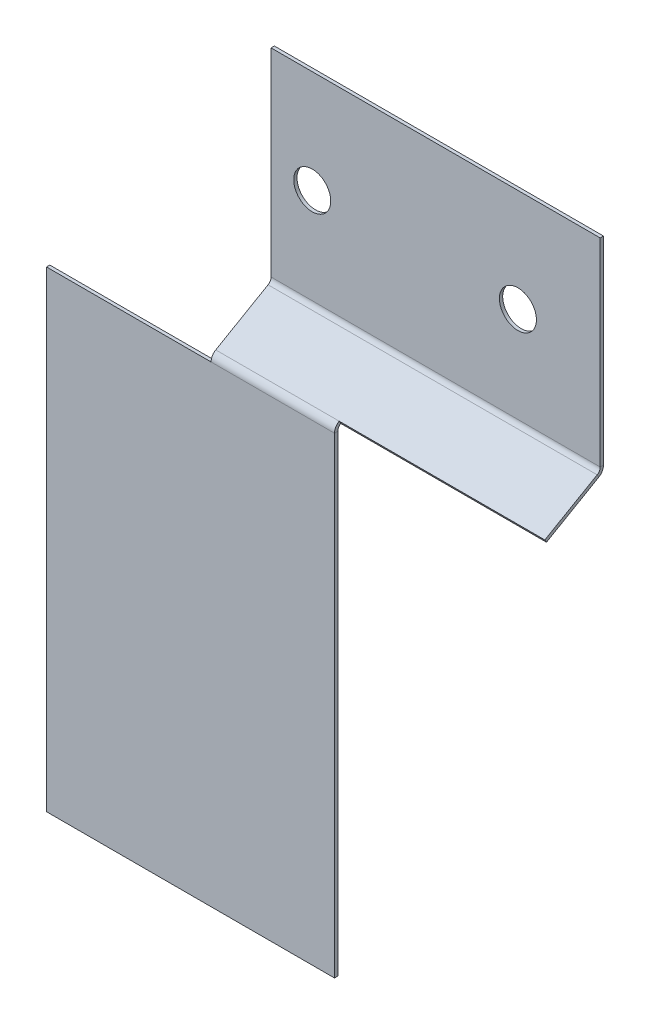
ISO-10303-21;
HEADER;
FILE_DESCRIPTION(('STEP AP214'),'2;1');
FILE_NAME('part.step','',(''),(''),'','','');
FILE_SCHEMA(('AUTOMOTIVE_DESIGN { 1 0 10303 214 1 1 1 1 }'));
ENDSEC;
DATA;
#1=APPLICATION_CONTEXT('core data for automotive mechanical design processes');
#2=APPLICATION_PROTOCOL_DEFINITION('international standard','automotive_design',2000,#1);
#3=PRODUCT_CONTEXT('',#1,'mechanical');
#4=PRODUCT('Part','Part','',(#3));
#5=PRODUCT_RELATED_PRODUCT_CATEGORY('part','',(#4));
#6=PRODUCT_DEFINITION_FORMATION('','',#4);
#7=PRODUCT_DEFINITION_CONTEXT('part definition',#1,'design');
#8=PRODUCT_DEFINITION('design','',#6,#7);
#9=PRODUCT_DEFINITION_SHAPE('','',#8);
#10=(LENGTH_UNIT() NAMED_UNIT(*) SI_UNIT(.MILLI.,.METRE.));
#11=(NAMED_UNIT(*) PLANE_ANGLE_UNIT() SI_UNIT($,.RADIAN.));
#12=(NAMED_UNIT(*) SI_UNIT($,.STERADIAN.) SOLID_ANGLE_UNIT());
#13=UNCERTAINTY_MEASURE_WITH_UNIT(LENGTH_MEASURE(1.E-05),#10,'distance_accuracy_value','');
#14=(GEOMETRIC_REPRESENTATION_CONTEXT(3) GLOBAL_UNCERTAINTY_ASSIGNED_CONTEXT((#13)) GLOBAL_UNIT_ASSIGNED_CONTEXT((#10,
#11,#12)) REPRESENTATION_CONTEXT('',''));
#15=CARTESIAN_POINT('',(0.,0.,0.));
#16=DIRECTION('',(0.,0.,1.));
#17=DIRECTION('',(1.,0.,0.));
#18=AXIS2_PLACEMENT_3D('',#15,#16,#17);
#19=CARTESIAN_POINT('',(0.,-3.76905989232418,6.52820323027549));
#20=DIRECTION('',(0.,0.500000000000004,-0.866025403784436));
#21=DIRECTION('',(0.,0.866025403784436,0.500000000000004));
#22=AXIS2_PLACEMENT_3D('',#19,#20,#21);
#23=PLANE('',#22);
#24=DIRECTION('',(0.,0.866025403784436,0.500000000000004));
#25=VECTOR('',#24,1.);
#26=CARTESIAN_POINT('',(15.,-3.76905989232418,6.52820323027549));
#27=LINE('',#26,#25);
#28=CARTESIAN_POINT('',(15.,-3.76905989232418,6.52820323027549));
#29=VERTEX_POINT('',#28);
#30=CARTESIAN_POINT('',(15.,-3.4226497308104,6.72820323027549));
#31=VERTEX_POINT('',#30);
#32=EDGE_CURVE('E92',#29,#31,#27,.T.);
#33=ORIENTED_EDGE('',*,*,#32,.F.);
#34=DIRECTION('',(-1.,0.,0.));
#35=VECTOR('',#34,1.);
#36=CARTESIAN_POINT('',(0.,-3.76905989232418,6.52820323027549));
#37=LINE('',#36,#35);
#38=CARTESIAN_POINT('',(40.,-3.76905989232418,6.52820323027549));
#39=VERTEX_POINT('',#38);
#40=EDGE_CURVE('E237',#39,#29,#37,.T.);
#41=ORIENTED_EDGE('',*,*,#40,.F.);
#42=DIRECTION('',(0.,0.866025403784436,0.500000000000004));
#43=VECTOR('',#42,1.);
#44=CARTESIAN_POINT('',(40.,-3.76905989232418,6.52820323027549));
#45=LINE('',#44,#43);
#46=CARTESIAN_POINT('',(40.,-3.4226497308104,6.72820323027549));
#47=VERTEX_POINT('',#46);
#48=EDGE_CURVE('E231',#39,#47,#45,.T.);
#49=ORIENTED_EDGE('',*,*,#48,.T.);
#50=DIRECTION('',(1.,0.,0.));
#51=VECTOR('',#50,1.);
#52=CARTESIAN_POINT('',(0.,-3.4226497308104,6.72820323027549));
#53=LINE('',#52,#51);
#54=EDGE_CURVE('E244',#47,#31,#53,.F.);
#55=ORIENTED_EDGE('',*,*,#54,.T.);
#56=EDGE_LOOP('',(#33,#41,#49,#55));
#57=FACE_BOUND('',#56,.T.);
#58=ADVANCED_FACE('F77',(#57),#23,.F.);
#59=CARTESIAN_POINT('',(40.,0.,-0.4));
#60=DIRECTION('',(1.,0.,0.));
#61=DIRECTION('',(0.,0.,-1.));
#62=AXIS2_PLACEMENT_3D('',#59,#60,#61);
#63=PLANE('',#62);
#64=DIRECTION('',(0.,1.,0.));
#65=VECTOR('',#64,1.);
#66=CARTESIAN_POINT('',(40.,0.,0.));
#67=LINE('',#66,#65);
#68=CARTESIAN_POINT('',(40.,0.887156423636778,0.));
#69=VERTEX_POINT('',#68);
#70=CARTESIAN_POINT('',(40.,25.,0.));
#71=VERTEX_POINT('',#70);
#72=EDGE_CURVE('E303',#69,#71,#67,.T.);
#73=ORIENTED_EDGE('',*,*,#72,.F.);
#74=DIRECTION('',(0.,0.,-1.));
#75=VECTOR('',#74,1.);
#76=CARTESIAN_POINT('',(40.,0.887156423636778,0.));
#77=LINE('',#76,#75);
#78=CARTESIAN_POINT('',(40.,0.887156423636778,-0.4));
#79=VERTEX_POINT('',#78);
#80=EDGE_CURVE('E265',#69,#79,#77,.T.);
#81=ORIENTED_EDGE('',*,*,#80,.T.);
#82=DIRECTION('',(0.,1.,0.));
#83=VECTOR('',#82,1.);
#84=CARTESIAN_POINT('',(40.,0.,-0.4));
#85=LINE('',#84,#83);
#86=CARTESIAN_POINT('',(40.,25.,-0.4));
#87=VERTEX_POINT('',#86);
#88=EDGE_CURVE('E295',#79,#87,#85,.T.);
#89=ORIENTED_EDGE('',*,*,#88,.T.);
#90=DIRECTION('',(0.,0.,1.));
#91=VECTOR('',#90,1.);
#92=CARTESIAN_POINT('',(40.,25.,-0.4));
#93=LINE('',#92,#91);
#94=EDGE_CURVE('E81',#87,#71,#93,.T.);
#95=ORIENTED_EDGE('',*,*,#94,.T.);
#96=EDGE_LOOP('',(#73,#81,#89,#95));
#97=FACE_BOUND('',#96,.T.);
#98=ADVANCED_FACE('F333',(#97),#63,.T.);
#99=CARTESIAN_POINT('',(0.,0.,-0.4));
#100=DIRECTION('',(0.,0.,-1.));
#101=DIRECTION('',(-1.,0.,0.));
#102=AXIS2_PLACEMENT_3D('',#99,#100,#101);
#103=PLANE('',#102);
#104=CARTESIAN_POINT('',(30.,12.5,-0.4));
#105=DIRECTION('',(0.,0.,1.));
#106=DIRECTION('',(1.,0.,0.));
#107=AXIS2_PLACEMENT_3D('',#104,#105,#106);
#108=CIRCLE('',#107,2.25);
#109=CARTESIAN_POINT('',(32.25,12.5,-0.4));
#110=VERTEX_POINT('',#109);
#111=EDGE_CURVE('E280',#110,#110,#108,.T.);
#112=ORIENTED_EDGE('',*,*,#111,.T.);
#113=EDGE_LOOP('',(#112));
#114=FACE_BOUND('',#113,.T.);
#115=CARTESIAN_POINT('',(5.,12.5,-0.4));
#116=DIRECTION('',(0.,0.,1.));
#117=DIRECTION('',(1.,0.,0.));
#118=AXIS2_PLACEMENT_3D('',#115,#116,#117);
#119=CIRCLE('',#118,2.25);
#120=CARTESIAN_POINT('',(7.25,12.5,-0.4));
#121=VERTEX_POINT('',#120);
#122=EDGE_CURVE('E286',#121,#121,#119,.T.);
#123=ORIENTED_EDGE('',*,*,#122,.T.);
#124=EDGE_LOOP('',(#123));
#125=FACE_BOUND('',#124,.T.);
#126=ORIENTED_EDGE('',*,*,#88,.F.);
#127=DIRECTION('',(1.,0.,0.));
#128=VECTOR('',#127,1.);
#129=CARTESIAN_POINT('',(40.,0.887156423636778,-0.4));
#130=LINE('',#129,#128);
#131=CARTESIAN_POINT('',(0.,0.887156423636781,-0.4));
#132=VERTEX_POINT('',#131);
#133=EDGE_CURVE('E260',#79,#132,#130,.F.);
#134=ORIENTED_EDGE('',*,*,#133,.T.);
#135=DIRECTION('',(0.,-1.,0.));
#136=VECTOR('',#135,1.);
#137=CARTESIAN_POINT('',(0.,0.,-0.4));
#138=LINE('',#137,#136);
#139=CARTESIAN_POINT('',(0.,25.,-0.4));
#140=VERTEX_POINT('',#139);
#141=EDGE_CURVE('E292',#140,#132,#138,.T.);
#142=ORIENTED_EDGE('',*,*,#141,.F.);
#143=DIRECTION('',(-1.,0.,0.));
#144=VECTOR('',#143,1.);
#145=CARTESIAN_POINT('',(0.,25.,-0.4));
#146=LINE('',#145,#144);
#147=EDGE_CURVE('E298',#87,#140,#146,.T.);
#148=ORIENTED_EDGE('',*,*,#147,.F.);
#149=EDGE_LOOP('',(#126,#134,#142,#148));
#150=FACE_BOUND('',#149,.T.);
#151=ADVANCED_FACE('F325',(#114,#125,#150),#103,.T.);
#152=CARTESIAN_POINT('',(0.,0.,0.));
#153=DIRECTION('',(0.,0.,-1.));
#154=DIRECTION('',(-1.,0.,0.));
#155=AXIS2_PLACEMENT_3D('',#152,#153,#154);
#156=PLANE('',#155);
#157=CARTESIAN_POINT('',(5.,12.5,0.));
#158=DIRECTION('',(0.,0.,1.));
#159=DIRECTION('',(1.,0.,0.));
#160=AXIS2_PLACEMENT_3D('',#157,#158,#159);
#161=CIRCLE('',#160,2.25);
#162=CARTESIAN_POINT('',(7.25,12.5,0.));
#163=VERTEX_POINT('',#162);
#164=EDGE_CURVE('E283',#163,#163,#161,.T.);
#165=ORIENTED_EDGE('',*,*,#164,.F.);
#166=EDGE_LOOP('',(#165));
#167=FACE_BOUND('',#166,.T.);
#168=CARTESIAN_POINT('',(30.,12.5,0.));
#169=DIRECTION('',(0.,0.,1.));
#170=DIRECTION('',(1.,0.,0.));
#171=AXIS2_PLACEMENT_3D('',#168,#169,#170);
#172=CIRCLE('',#171,2.25);
#173=CARTESIAN_POINT('',(32.25,12.5,0.));
#174=VERTEX_POINT('',#173);
#175=EDGE_CURVE('E277',#174,#174,#172,.T.);
#176=ORIENTED_EDGE('',*,*,#175,.F.);
#177=EDGE_LOOP('',(#176));
#178=FACE_BOUND('',#177,.T.);
#179=DIRECTION('',(1.,0.,0.));
#180=VECTOR('',#179,1.);
#181=CARTESIAN_POINT('',(40.,0.887156423636778,0.));
#182=LINE('',#181,#180);
#183=CARTESIAN_POINT('',(0.,0.887156423636778,0.));
#184=VERTEX_POINT('',#183);
#185=EDGE_CURVE('E271',#69,#184,#182,.F.);
#186=ORIENTED_EDGE('',*,*,#185,.F.);
#187=ORIENTED_EDGE('',*,*,#72,.T.);
#188=DIRECTION('',(-1.,0.,0.));
#189=VECTOR('',#188,1.);
#190=CARTESIAN_POINT('',(0.,25.,0.));
#191=LINE('',#190,#189);
#192=CARTESIAN_POINT('',(0.,25.,0.));
#193=VERTEX_POINT('',#192);
#194=EDGE_CURVE('E296',#71,#193,#191,.T.);
#195=ORIENTED_EDGE('',*,*,#194,.T.);
#196=DIRECTION('',(0.,-1.,0.));
#197=VECTOR('',#196,1.);
#198=CARTESIAN_POINT('',(0.,0.,0.));
#199=LINE('',#198,#197);
#200=EDGE_CURVE('E289',#193,#184,#199,.T.);
#201=ORIENTED_EDGE('',*,*,#200,.T.);
#202=EDGE_LOOP('',(#186,#187,#195,#201));
#203=FACE_BOUND('',#202,.T.);
#204=ADVANCED_FACE('F309',(#167,#178,#203),#156,.F.);
#205=CARTESIAN_POINT('',(0.,0.,-0.4));
#206=DIRECTION('',(-1.,0.,0.));
#207=DIRECTION('',(0.,0.,1.));
#208=AXIS2_PLACEMENT_3D('',#205,#206,#207);
#209=PLANE('',#208);
#210=DIRECTION('',(0.,0.,-1.));
#211=VECTOR('',#210,1.);
#212=CARTESIAN_POINT('',(0.,0.887156423636778,0.));
#213=LINE('',#212,#211);
#214=EDGE_CURVE('E275',#184,#132,#213,.T.);
#215=ORIENTED_EDGE('',*,*,#214,.F.);
#216=ORIENTED_EDGE('',*,*,#200,.F.);
#217=DIRECTION('',(0.,0.,1.));
#218=VECTOR('',#217,1.);
#219=CARTESIAN_POINT('',(0.,25.,-0.4));
#220=LINE('',#219,#218);
#221=EDGE_CURVE('E13',#140,#193,#220,.T.);
#222=ORIENTED_EDGE('',*,*,#221,.F.);
#223=ORIENTED_EDGE('',*,*,#141,.T.);
#224=EDGE_LOOP('',(#215,#216,#222,#223));
#225=FACE_BOUND('',#224,.T.);
#226=ADVANCED_FACE('F79',(#225),#209,.T.);
#227=CARTESIAN_POINT('',(0.,25.,-0.4));
#228=DIRECTION('',(0.,1.,0.));
#229=DIRECTION('',(0.,0.,1.));
#230=AXIS2_PLACEMENT_3D('',#227,#228,#229);
#231=PLANE('',#230);
#232=ORIENTED_EDGE('',*,*,#194,.F.);
#233=ORIENTED_EDGE('',*,*,#94,.F.);
#234=ORIENTED_EDGE('',*,*,#147,.T.);
#235=ORIENTED_EDGE('',*,*,#221,.T.);
#236=EDGE_LOOP('',(#232,#233,#234,#235));
#237=FACE_BOUND('',#236,.T.);
#238=ADVANCED_FACE('F316',(#237),#231,.T.);
#239=CARTESIAN_POINT('',(5.,12.5,-0.4));
#240=DIRECTION('',(0.,0.,1.));
#241=DIRECTION('',(1.,0.,0.));
#242=AXIS2_PLACEMENT_3D('',#239,#240,#241);
#243=CYLINDRICAL_SURFACE('',#242,2.25);
#244=ORIENTED_EDGE('',*,*,#122,.F.);
#245=EDGE_LOOP('',(#244));
#246=FACE_BOUND('',#245,.T.);
#247=ORIENTED_EDGE('',*,*,#164,.T.);
#248=EDGE_LOOP('',(#247));
#249=FACE_BOUND('',#248,.T.);
#250=ADVANCED_FACE('F345',(#246,#249),#243,.F.);
#251=CARTESIAN_POINT('',(30.,12.5,-0.4));
#252=DIRECTION('',(0.,0.,1.));
#253=DIRECTION('',(1.,0.,0.));
#254=AXIS2_PLACEMENT_3D('',#251,#252,#253);
#255=CYLINDRICAL_SURFACE('',#254,2.25);
#256=ORIENTED_EDGE('',*,*,#111,.F.);
#257=EDGE_LOOP('',(#256));
#258=FACE_BOUND('',#257,.T.);
#259=ORIENTED_EDGE('',*,*,#175,.T.);
#260=EDGE_LOOP('',(#259));
#261=FACE_BOUND('',#260,.T.);
#262=ADVANCED_FACE('F351',(#258,#261),#255,.F.);
#263=CARTESIAN_POINT('',(0.,0.887156423636778,0.7366));
#264=DIRECTION('',(-1.,0.,0.));
#265=DIRECTION('',(0.,0.,1.));
#266=AXIS2_PLACEMENT_3D('',#263,#264,#265);
#267=PLANE('',#266);
#268=DIRECTION('',(0.,0.866025403784436,0.500000000000004));
#269=VECTOR('',#268,1.);
#270=CARTESIAN_POINT('',(0.,-0.0971680503046125,0.168299999999995));
#271=LINE('',#270,#269);
#272=CARTESIAN_POINT('',(0.,0.249242111209162,0.368299999999997));
#273=VERTEX_POINT('',#272);
#274=CARTESIAN_POINT('',(0.,-0.0971680503046126,0.168299999999995));
#275=VERTEX_POINT('',#274);
#276=EDGE_CURVE('E230',#273,#275,#271,.F.);
#277=ORIENTED_EDGE('',*,*,#276,.F.);
#278=CARTESIAN_POINT('',(0.,0.887156423636778,0.7366));
#279=DIRECTION('',(1.,0.,0.));
#280=DIRECTION('',(0.,0.,-1.));
#281=AXIS2_PLACEMENT_3D('',#278,#279,#280);
#282=CIRCLE('',#281,0.7366);
#283=EDGE_CURVE('E268',#184,#273,#282,.F.);
#284=ORIENTED_EDGE('',*,*,#283,.F.);
#285=ORIENTED_EDGE('',*,*,#214,.T.);
#286=CARTESIAN_POINT('',(0.,0.887156423636778,0.7366));
#287=DIRECTION('',(1.,0.,0.));
#288=DIRECTION('',(0.,0.,-1.));
#289=AXIS2_PLACEMENT_3D('',#286,#287,#288);
#290=CIRCLE('',#289,1.1366);
#291=EDGE_CURVE('E100',#132,#275,#290,.F.);
#292=ORIENTED_EDGE('',*,*,#291,.T.);
#293=EDGE_LOOP('',(#277,#284,#285,#292));
#294=FACE_BOUND('',#293,.T.);
#295=ADVANCED_FACE('F322',(#294),#267,.T.);
#296=CARTESIAN_POINT('',(40.,0.887156423636778,0.7366));
#297=DIRECTION('',(-1.,0.,0.));
#298=DIRECTION('',(0.,0.,1.));
#299=AXIS2_PLACEMENT_3D('',#296,#297,#298);
#300=PLANE('',#299);
#301=CARTESIAN_POINT('',(40.,0.887156423636778,0.7366));
#302=DIRECTION('',(1.,0.,0.));
#303=DIRECTION('',(0.,0.,-1.));
#304=AXIS2_PLACEMENT_3D('',#301,#302,#303);
#305=CIRCLE('',#304,0.7366);
#306=CARTESIAN_POINT('',(40.,0.249242111209162,0.368299999999997));
#307=VERTEX_POINT('',#306);
#308=EDGE_CURVE('E234',#307,#69,#305,.T.);
#309=ORIENTED_EDGE('',*,*,#308,.F.);
#310=DIRECTION('',(0.,0.866025403784436,0.500000000000004));
#311=VECTOR('',#310,1.);
#312=CARTESIAN_POINT('',(40.,0.249242111209162,0.368299999999997));
#313=LINE('',#312,#311);
#314=CARTESIAN_POINT('',(40.,-0.0971680503046125,0.168299999999995));
#315=VERTEX_POINT('',#314);
#316=EDGE_CURVE('E253',#307,#315,#313,.F.);
#317=ORIENTED_EDGE('',*,*,#316,.T.);
#318=CARTESIAN_POINT('',(40.,0.887156423636778,0.7366));
#319=DIRECTION('',(1.,0.,0.));
#320=DIRECTION('',(0.,0.,-1.));
#321=AXIS2_PLACEMENT_3D('',#318,#319,#320);
#322=CIRCLE('',#321,1.1366);
#323=EDGE_CURVE('E263',#315,#79,#322,.T.);
#324=ORIENTED_EDGE('',*,*,#323,.T.);
#325=ORIENTED_EDGE('',*,*,#80,.F.);
#326=EDGE_LOOP('',(#309,#317,#324,#325));
#327=FACE_BOUND('',#326,.T.);
#328=ADVANCED_FACE('F329',(#327),#300,.F.);
#329=CARTESIAN_POINT('',(40.,0.887156423636778,0.7366));
#330=DIRECTION('',(1.,0.,0.));
#331=DIRECTION('',(0.,-0.866025403784436,-0.500000000000004));
#332=AXIS2_PLACEMENT_3D('',#329,#330,#331);
#333=CYLINDRICAL_SURFACE('',#332,1.1366);
#334=ORIENTED_EDGE('',*,*,#133,.F.);
#335=ORIENTED_EDGE('',*,*,#323,.F.);
#336=DIRECTION('',(1.,0.,0.));
#337=VECTOR('',#336,1.);
#338=CARTESIAN_POINT('',(0.,-0.0971680503046125,0.168299999999995));
#339=LINE('',#338,#337);
#340=EDGE_CURVE('E251',#315,#275,#339,.F.);
#341=ORIENTED_EDGE('',*,*,#340,.T.);
#342=ORIENTED_EDGE('',*,*,#291,.F.);
#343=EDGE_LOOP('',(#334,#335,#341,#342));
#344=FACE_BOUND('',#343,.T.);
#345=ADVANCED_FACE('F326',(#344),#333,.T.);
#346=CARTESIAN_POINT('',(40.,0.887156423636778,0.7366));
#347=DIRECTION('',(1.,0.,0.));
#348=DIRECTION('',(0.,-0.866025403784436,-0.500000000000004));
#349=AXIS2_PLACEMENT_3D('',#346,#347,#348);
#350=CYLINDRICAL_SURFACE('',#349,0.7366);
#351=ORIENTED_EDGE('',*,*,#185,.T.);
#352=ORIENTED_EDGE('',*,*,#283,.T.);
#353=DIRECTION('',(1.,0.,0.));
#354=VECTOR('',#353,1.);
#355=CARTESIAN_POINT('',(0.,0.249242111209162,0.368299999999997));
#356=LINE('',#355,#354);
#357=EDGE_CURVE('E256',#273,#307,#356,.T.);
#358=ORIENTED_EDGE('',*,*,#357,.T.);
#359=ORIENTED_EDGE('',*,*,#308,.T.);
#360=EDGE_LOOP('',(#351,#352,#358,#359));
#361=FACE_BOUND('',#360,.T.);
#362=ADVANCED_FACE('F360',(#361),#350,.F.);
#363=CARTESIAN_POINT('',(0.,0.115470053837927,-0.200000000000002));
#364=DIRECTION('',(1.,0.,0.));
#365=DIRECTION('',(0.,0.,-1.));
#366=AXIS2_PLACEMENT_3D('',#363,#364,#365);
#367=PLANE('',#366);
#368=ORIENTED_EDGE('',*,*,#276,.T.);
#369=DIRECTION('',(0.,0.500000000000004,-0.866025403784436));
#370=VECTOR('',#369,1.);
#371=CARTESIAN_POINT('',(0.,0.115470053837927,-0.200000000000002));
#372=LINE('',#371,#370);
#373=CARTESIAN_POINT('',(0.,-3.76905989232418,6.52820323027549));
#374=VERTEX_POINT('',#373);
#375=EDGE_CURVE('E241',#374,#275,#372,.T.);
#376=ORIENTED_EDGE('',*,*,#375,.F.);
#377=DIRECTION('',(0.,0.866025403784436,0.500000000000004));
#378=VECTOR('',#377,1.);
#379=CARTESIAN_POINT('',(0.,-3.76905989232418,6.52820323027549));
#380=LINE('',#379,#378);
#381=CARTESIAN_POINT('',(0.,-3.4226497308104,6.72820323027549));
#382=VERTEX_POINT('',#381);
#383=EDGE_CURVE('E235',#374,#382,#380,.T.);
#384=ORIENTED_EDGE('',*,*,#383,.T.);
#385=DIRECTION('',(0.,-0.500000000000004,0.866025403784436));
#386=VECTOR('',#385,1.);
#387=CARTESIAN_POINT('',(0.,0.461880215351702,0.));
#388=LINE('',#387,#386);
#389=EDGE_CURVE('E248',#382,#273,#388,.F.);
#390=ORIENTED_EDGE('',*,*,#389,.T.);
#391=EDGE_LOOP('',(#368,#376,#384,#390));
#392=FACE_BOUND('',#391,.T.);
#393=ADVANCED_FACE('F363',(#392),#367,.F.);
#394=CARTESIAN_POINT('',(40.,-3.76905989232418,6.52820323027549));
#395=DIRECTION('',(-1.,0.,0.));
#396=DIRECTION('',(0.,0.,1.));
#397=AXIS2_PLACEMENT_3D('',#394,#395,#396);
#398=PLANE('',#397);
#399=ORIENTED_EDGE('',*,*,#316,.F.);
#400=DIRECTION('',(0.,0.500000000000004,-0.866025403784436));
#401=VECTOR('',#400,1.);
#402=CARTESIAN_POINT('',(40.,-3.4226497308104,6.72820323027549));
#403=LINE('',#402,#401);
#404=EDGE_CURVE('E246',#307,#47,#403,.F.);
#405=ORIENTED_EDGE('',*,*,#404,.T.);
#406=ORIENTED_EDGE('',*,*,#48,.F.);
#407=DIRECTION('',(0.,-0.500000000000004,0.866025403784436));
#408=VECTOR('',#407,1.);
#409=CARTESIAN_POINT('',(40.,0.115470053837927,-0.200000000000002));
#410=LINE('',#409,#408);
#411=EDGE_CURVE('E239',#315,#39,#410,.T.);
#412=ORIENTED_EDGE('',*,*,#411,.F.);
#413=EDGE_LOOP('',(#399,#405,#406,#412));
#414=FACE_BOUND('',#413,.T.);
#415=ADVANCED_FACE('F369',(#414),#398,.F.);
#416=CARTESIAN_POINT('',(0.,0.115470053837927,-0.200000000000002));
#417=DIRECTION('',(0.,0.866025403784436,0.500000000000004));
#418=DIRECTION('',(0.,-0.500000000000004,0.866025403784436));
#419=AXIS2_PLACEMENT_3D('',#416,#417,#418);
#420=PLANE('',#419);
#421=ORIENTED_EDGE('',*,*,#340,.F.);
#422=ORIENTED_EDGE('',*,*,#411,.T.);
#423=ORIENTED_EDGE('',*,*,#40,.T.);
#424=DIRECTION('',(-1.,0.,0.));
#425=VECTOR('',#424,1.);
#426=CARTESIAN_POINT('',(0.,-3.76905989232418,6.52820323027549));
#427=LINE('',#426,#425);
#428=EDGE_CURVE('E214',#374,#29,#427,.F.);
#429=ORIENTED_EDGE('',*,*,#428,.F.);
#430=ORIENTED_EDGE('',*,*,#375,.T.);
#431=EDGE_LOOP('',(#421,#422,#423,#429,#430));
#432=FACE_BOUND('',#431,.T.);
#433=ADVANCED_FACE('F372',(#432),#420,.F.);
#434=CARTESIAN_POINT('',(0.,0.461880215351702,0.));
#435=DIRECTION('',(0.,0.866025403784436,0.500000000000004));
#436=DIRECTION('',(0.,-0.500000000000004,0.866025403784436));
#437=AXIS2_PLACEMENT_3D('',#434,#435,#436);
#438=PLANE('',#437);
#439=ORIENTED_EDGE('',*,*,#404,.F.);
#440=ORIENTED_EDGE('',*,*,#357,.F.);
#441=ORIENTED_EDGE('',*,*,#389,.F.);
#442=DIRECTION('',(-1.,0.,0.));
#443=VECTOR('',#442,1.);
#444=CARTESIAN_POINT('',(0.,-3.4226497308104,6.72820323027549));
#445=LINE('',#444,#443);
#446=EDGE_CURVE('E424',#382,#31,#445,.F.);
#447=ORIENTED_EDGE('',*,*,#446,.T.);
#448=ORIENTED_EDGE('',*,*,#54,.F.);
#449=EDGE_LOOP('',(#439,#440,#441,#447,#448));
#450=FACE_BOUND('',#449,.T.);
#451=ADVANCED_FACE('F375',(#450),#438,.T.);
#452=CARTESIAN_POINT('',(15.,-4.4069742047518,6.15990323027549));
#453=DIRECTION('',(1.,0.,0.));
#454=DIRECTION('',(0.,0.,-1.));
#455=AXIS2_PLACEMENT_3D('',#452,#453,#454);
#456=PLANE('',#455);
#457=DIRECTION('',(0.,0.,-1.));
#458=VECTOR('',#457,1.);
#459=CARTESIAN_POINT('',(15.,-4.4069742047518,7.29650323027549));
#460=LINE('',#459,#458);
#461=CARTESIAN_POINT('',(15.,-4.4069742047518,6.89650323027549));
#462=VERTEX_POINT('',#461);
#463=CARTESIAN_POINT('',(15.,-4.4069742047518,7.29650323027549));
#464=VERTEX_POINT('',#463);
#465=EDGE_CURVE('E197',#462,#464,#460,.F.);
#466=ORIENTED_EDGE('',*,*,#465,.F.);
#467=CARTESIAN_POINT('',(15.,-4.4069742047518,6.15990323027549));
#468=DIRECTION('',(-1.,0.,0.));
#469=DIRECTION('',(0.,0.,1.));
#470=AXIS2_PLACEMENT_3D('',#467,#468,#469);
#471=CIRCLE('',#470,0.7366);
#472=EDGE_CURVE('E208',#29,#462,#471,.F.);
#473=ORIENTED_EDGE('',*,*,#472,.F.);
#474=ORIENTED_EDGE('',*,*,#32,.T.);
#475=CARTESIAN_POINT('',(15.,-4.4069742047518,6.15990323027549));
#476=DIRECTION('',(-1.,0.,0.));
#477=DIRECTION('',(0.,0.,1.));
#478=AXIS2_PLACEMENT_3D('',#475,#476,#477);
#479=CIRCLE('',#478,1.1366);
#480=EDGE_CURVE('E210',#31,#464,#479,.F.);
#481=ORIENTED_EDGE('',*,*,#480,.T.);
#482=EDGE_LOOP('',(#466,#473,#474,#481));
#483=FACE_BOUND('',#482,.T.);
#484=ADVANCED_FACE('F207',(#483),#456,.T.);
#485=CARTESIAN_POINT('',(0.,-4.4069742047518,6.15990323027549));
#486=DIRECTION('',(1.,0.,0.));
#487=DIRECTION('',(0.,0.,-1.));
#488=AXIS2_PLACEMENT_3D('',#485,#486,#487);
#489=PLANE('',#488);
#490=CARTESIAN_POINT('',(0.,-4.4069742047518,6.15990323027549));
#491=DIRECTION('',(-1.,0.,0.));
#492=DIRECTION('',(0.,0.,1.));
#493=AXIS2_PLACEMENT_3D('',#490,#491,#492);
#494=CIRCLE('',#493,0.7366);
#495=CARTESIAN_POINT('',(0.,-4.4069742047518,6.89650323027549));
#496=VERTEX_POINT('',#495);
#497=EDGE_CURVE('E220',#496,#374,#494,.T.);
#498=ORIENTED_EDGE('',*,*,#497,.F.);
#499=DIRECTION('',(0.,0.,1.));
#500=VECTOR('',#499,1.);
#501=CARTESIAN_POINT('',(0.,-4.4069742047518,6.89650323027549));
#502=LINE('',#501,#500);
#503=CARTESIAN_POINT('',(0.,-4.4069742047518,7.29650323027549));
#504=VERTEX_POINT('',#503);
#505=EDGE_CURVE('E227',#496,#504,#502,.T.);
#506=ORIENTED_EDGE('',*,*,#505,.T.);
#507=CARTESIAN_POINT('',(0.,-4.4069742047518,6.15990323027549));
#508=DIRECTION('',(-1.,0.,0.));
#509=DIRECTION('',(0.,0.,1.));
#510=AXIS2_PLACEMENT_3D('',#507,#508,#509);
#511=CIRCLE('',#510,1.1366);
#512=EDGE_CURVE('E218',#504,#382,#511,.T.);
#513=ORIENTED_EDGE('',*,*,#512,.T.);
#514=ORIENTED_EDGE('',*,*,#383,.F.);
#515=EDGE_LOOP('',(#498,#506,#513,#514));
#516=FACE_BOUND('',#515,.T.);
#517=ADVANCED_FACE('F382',(#516),#489,.F.);
#518=CARTESIAN_POINT('',(0.,-4.4069742047518,6.15990323027549));
#519=DIRECTION('',(-1.,0.,0.));
#520=DIRECTION('',(0.,0.,1.));
#521=AXIS2_PLACEMENT_3D('',#518,#519,#520);
#522=CYLINDRICAL_SURFACE('',#521,1.1366);
#523=ORIENTED_EDGE('',*,*,#446,.F.);
#524=ORIENTED_EDGE('',*,*,#512,.F.);
#525=DIRECTION('',(-1.,0.,0.));
#526=VECTOR('',#525,1.);
#527=CARTESIAN_POINT('',(0.,-4.4069742047518,7.29650323027549));
#528=LINE('',#527,#526);
#529=EDGE_CURVE('E215',#464,#504,#528,.T.);
#530=ORIENTED_EDGE('',*,*,#529,.F.);
#531=ORIENTED_EDGE('',*,*,#480,.F.);
#532=EDGE_LOOP('',(#523,#524,#530,#531));
#533=FACE_BOUND('',#532,.T.);
#534=ADVANCED_FACE('F385',(#533),#522,.T.);
#535=CARTESIAN_POINT('',(0.,-4.4069742047518,6.15990323027549));
#536=DIRECTION('',(-1.,0.,0.));
#537=DIRECTION('',(0.,0.,1.));
#538=AXIS2_PLACEMENT_3D('',#535,#536,#537);
#539=CYLINDRICAL_SURFACE('',#538,0.7366);
#540=ORIENTED_EDGE('',*,*,#428,.T.);
#541=ORIENTED_EDGE('',*,*,#472,.T.);
#542=DIRECTION('',(-1.,0.,0.));
#543=VECTOR('',#542,1.);
#544=CARTESIAN_POINT('',(15.,-4.4069742047518,6.89650323027549));
#545=LINE('',#544,#543);
#546=EDGE_CURVE('E179',#462,#496,#545,.T.);
#547=ORIENTED_EDGE('',*,*,#546,.T.);
#548=ORIENTED_EDGE('',*,*,#497,.T.);
#549=EDGE_LOOP('',(#540,#541,#547,#548));
#550=FACE_BOUND('',#549,.T.);
#551=ADVANCED_FACE('F213',(#550),#539,.F.);
#552=CARTESIAN_POINT('',(15.,-4.4069742047518,6.89650323027549));
#553=DIRECTION('',(0.,1.,0.));
#554=DIRECTION('',(0.,0.,1.));
#555=AXIS2_PLACEMENT_3D('',#552,#553,#554);
#556=PLANE('',#555);
#557=ORIENTED_EDGE('',*,*,#505,.F.);
#558=CARTESIAN_POINT('',(-20.,-4.4069742047518,6.89650323027549));
#559=VERTEX_POINT('',#558);
#560=EDGE_CURVE('E185',#496,#559,#545,.T.);
#561=ORIENTED_EDGE('',*,*,#560,.T.);
#562=DIRECTION('',(0.,0.,-1.));
#563=VECTOR('',#562,1.);
#564=CARTESIAN_POINT('',(-20.,-4.4069742047518,6.89650323027549));
#565=LINE('',#564,#563);
#566=CARTESIAN_POINT('',(-20.,-4.4069742047518,7.29650323027549));
#567=VERTEX_POINT('',#566);
#568=EDGE_CURVE('E190',#559,#567,#565,.F.);
#569=ORIENTED_EDGE('',*,*,#568,.T.);
#570=DIRECTION('',(-1.,0.,0.));
#571=VECTOR('',#570,1.);
#572=CARTESIAN_POINT('',(15.,-4.4069742047518,7.29650323027549));
#573=LINE('',#572,#571);
#574=EDGE_CURVE('E417',#567,#504,#573,.F.);
#575=ORIENTED_EDGE('',*,*,#574,.T.);
#576=EDGE_LOOP('',(#557,#561,#569,#575));
#577=FACE_BOUND('',#576,.T.);
#578=ADVANCED_FACE('F391',(#577),#556,.T.);
#579=CARTESIAN_POINT('',(-20.,-61.7507578887909,7.29650323027548));
#580=DIRECTION('',(1.,0.,0.));
#581=DIRECTION('',(0.,1.,0.));
#582=AXIS2_PLACEMENT_3D('',#579,#580,#581);
#583=PLANE('',#582);
#584=ORIENTED_EDGE('',*,*,#568,.F.);
#585=DIRECTION('',(0.,1.,0.));
#586=VECTOR('',#585,1.);
#587=CARTESIAN_POINT('',(-20.,-61.7507578887909,6.89650323027548));
#588=LINE('',#587,#586);
#589=CARTESIAN_POINT('',(-20.,-61.7507578887909,6.89650323027548));
#590=VERTEX_POINT('',#589);
#591=EDGE_CURVE('E432',#559,#590,#588,.F.);
#592=ORIENTED_EDGE('',*,*,#591,.T.);
#593=DIRECTION('',(0.,0.,-1.));
#594=VECTOR('',#593,1.);
#595=CARTESIAN_POINT('',(-20.,-61.7507578887909,7.29650323027548));
#596=LINE('',#595,#594);
#597=CARTESIAN_POINT('',(-20.,-61.7507578887909,7.29650323027548));
#598=VERTEX_POINT('',#597);
#599=EDGE_CURVE('E225',#598,#590,#596,.T.);
#600=ORIENTED_EDGE('',*,*,#599,.F.);
#601=DIRECTION('',(0.,-1.,0.));
#602=VECTOR('',#601,1.);
#603=CARTESIAN_POINT('',(-20.,-0.212638104142543,7.29650323027549));
#604=LINE('',#603,#602);
#605=EDGE_CURVE('E201',#567,#598,#604,.T.);
#606=ORIENTED_EDGE('',*,*,#605,.F.);
#607=EDGE_LOOP('',(#584,#592,#600,#606));
#608=FACE_BOUND('',#607,.T.);
#609=ADVANCED_FACE('F395',(#608),#583,.F.);
#610=CARTESIAN_POINT('',(15.,-3.98169799646672,7.29650323027549));
#611=DIRECTION('',(-1.,0.,0.));
#612=DIRECTION('',(0.,0.,1.));
#613=AXIS2_PLACEMENT_3D('',#610,#611,#612);
#614=PLANE('',#613);
#615=ORIENTED_EDGE('',*,*,#465,.T.);
#616=DIRECTION('',(0.,1.,0.));
#617=VECTOR('',#616,1.);
#618=CARTESIAN_POINT('',(15.,-0.21263810414254,7.29650323027549));
#619=LINE('',#618,#617);
#620=CARTESIAN_POINT('',(15.,-61.7507578887909,7.29650323027548));
#621=VERTEX_POINT('',#620);
#622=EDGE_CURVE('E438',#621,#464,#619,.T.);
#623=ORIENTED_EDGE('',*,*,#622,.F.);
#624=DIRECTION('',(0.,0.,-1.));
#625=VECTOR('',#624,1.);
#626=CARTESIAN_POINT('',(15.,-61.7507578887909,7.29650323027548));
#627=LINE('',#626,#625);
#628=CARTESIAN_POINT('',(15.,-61.7507578887909,6.89650323027548));
#629=VERTEX_POINT('',#628);
#630=EDGE_CURVE('E200',#621,#629,#627,.T.);
#631=ORIENTED_EDGE('',*,*,#630,.T.);
#632=DIRECTION('',(0.,-1.,0.));
#633=VECTOR('',#632,1.);
#634=CARTESIAN_POINT('',(15.,-3.98169799646672,6.89650323027549));
#635=LINE('',#634,#633);
#636=EDGE_CURVE('E184',#629,#462,#635,.F.);
#637=ORIENTED_EDGE('',*,*,#636,.T.);
#638=EDGE_LOOP('',(#615,#623,#631,#637));
#639=FACE_BOUND('',#638,.T.);
#640=ADVANCED_FACE('F195',(#639),#614,.F.);
#641=CARTESIAN_POINT('',(0.,-0.21263810414254,7.29650323027549));
#642=DIRECTION('',(0.,0.,-1.));
#643=DIRECTION('',(0.,1.,0.));
#644=AXIS2_PLACEMENT_3D('',#641,#642,#643);
#645=PLANE('',#644);
#646=ORIENTED_EDGE('',*,*,#574,.F.);
#647=ORIENTED_EDGE('',*,*,#605,.T.);
#648=DIRECTION('',(1.,0.,0.));
#649=VECTOR('',#648,1.);
#650=CARTESIAN_POINT('',(0.,-61.7507578887909,7.29650323027548));
#651=LINE('',#650,#649);
#652=EDGE_CURVE('E436',#598,#621,#651,.T.);
#653=ORIENTED_EDGE('',*,*,#652,.T.);
#654=ORIENTED_EDGE('',*,*,#622,.T.);
#655=ORIENTED_EDGE('',*,*,#529,.T.);
#656=EDGE_LOOP('',(#646,#647,#653,#654,#655));
#657=FACE_BOUND('',#656,.T.);
#658=ADVANCED_FACE('F405',(#657),#645,.F.);
#659=CARTESIAN_POINT('',(0.,-0.21263810414254,6.89650323027549));
#660=DIRECTION('',(0.,0.,-1.));
#661=DIRECTION('',(0.,1.,0.));
#662=AXIS2_PLACEMENT_3D('',#659,#660,#661);
#663=PLANE('',#662);
#664=ORIENTED_EDGE('',*,*,#591,.F.);
#665=ORIENTED_EDGE('',*,*,#560,.F.);
#666=ORIENTED_EDGE('',*,*,#546,.F.);
#667=ORIENTED_EDGE('',*,*,#636,.F.);
#668=DIRECTION('',(-1.,0.,0.));
#669=VECTOR('',#668,1.);
#670=CARTESIAN_POINT('',(15.,-61.7507578887909,6.89650323027548));
#671=LINE('',#670,#669);
#672=EDGE_CURVE('E202',#590,#629,#671,.F.);
#673=ORIENTED_EDGE('',*,*,#672,.F.);
#674=EDGE_LOOP('',(#664,#665,#666,#667,#673));
#675=FACE_BOUND('',#674,.T.);
#676=ADVANCED_FACE('F182',(#675),#663,.T.);
#677=CARTESIAN_POINT('',(15.,-61.7507578887909,7.29650323027548));
#678=DIRECTION('',(0.,1.,0.));
#679=DIRECTION('',(0.,0.,1.));
#680=AXIS2_PLACEMENT_3D('',#677,#678,#679);
#681=PLANE('',#680);
#682=ORIENTED_EDGE('',*,*,#672,.T.);
#683=ORIENTED_EDGE('',*,*,#630,.F.);
#684=ORIENTED_EDGE('',*,*,#652,.F.);
#685=ORIENTED_EDGE('',*,*,#599,.T.);
#686=EDGE_LOOP('',(#682,#683,#684,#685));
#687=FACE_BOUND('',#686,.T.);
#688=ADVANCED_FACE('F399',(#687),#681,.F.);
#689=CLOSED_SHELL('',(#58,#98,#151,#204,#226,#238,#250,#262,#295,#328,#345,#362,#393,#415,#433,
#451,#484,#517,#534,#551,#578,#609,#640,#658,#676,#688));
#690=MANIFOLD_SOLID_BREP('B2',#689);
#691=ADVANCED_BREP_SHAPE_REPRESENTATION('',(#18,#690),#14);
#692=SHAPE_DEFINITION_REPRESENTATION(#9,#691);
ENDSEC;
END-ISO-10303-21;
